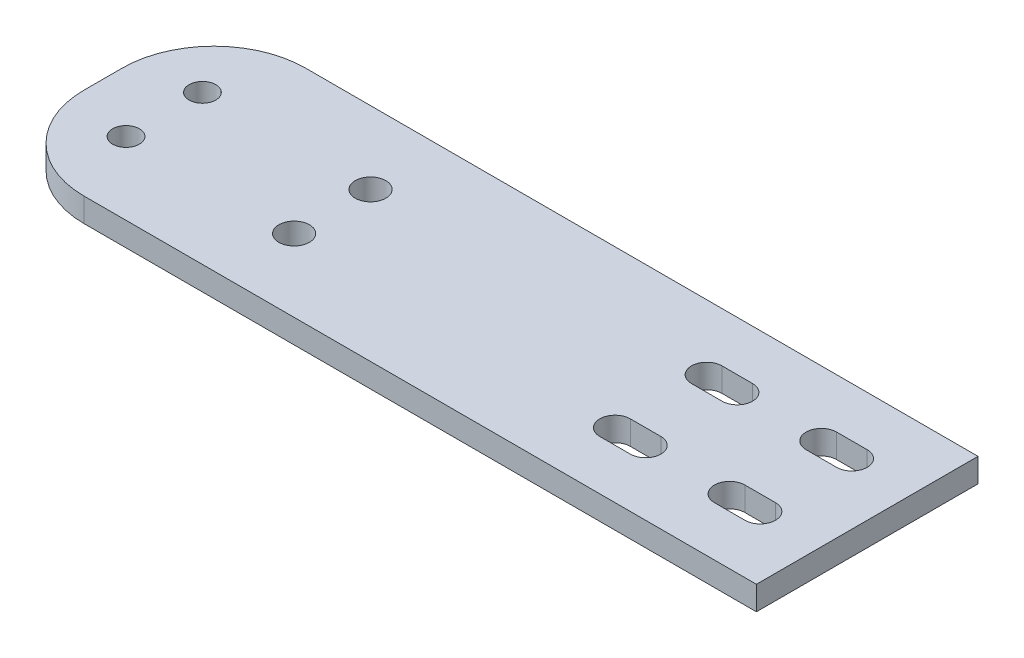
ISO-10303-21;
HEADER;
FILE_DESCRIPTION(('STEP AP214'),'2;1');
FILE_NAME('part.step','',(''),(''),'','','');
FILE_SCHEMA(('AUTOMOTIVE_DESIGN { 1 0 10303 214 1 1 1 1 }'));
ENDSEC;
DATA;
#1=APPLICATION_CONTEXT('core data for automotive mechanical design processes');
#2=APPLICATION_PROTOCOL_DEFINITION('international standard','automotive_design',2000,#1);
#3=PRODUCT_CONTEXT('',#1,'mechanical');
#4=PRODUCT('Part','Part','',(#3));
#5=PRODUCT_RELATED_PRODUCT_CATEGORY('part','',(#4));
#6=PRODUCT_DEFINITION_FORMATION('','',#4);
#7=PRODUCT_DEFINITION_CONTEXT('part definition',#1,'design');
#8=PRODUCT_DEFINITION('design','',#6,#7);
#9=PRODUCT_DEFINITION_SHAPE('','',#8);
#10=(LENGTH_UNIT() NAMED_UNIT(*) SI_UNIT(.MILLI.,.METRE.));
#11=(NAMED_UNIT(*) PLANE_ANGLE_UNIT() SI_UNIT($,.RADIAN.));
#12=(NAMED_UNIT(*) SI_UNIT($,.STERADIAN.) SOLID_ANGLE_UNIT());
#13=UNCERTAINTY_MEASURE_WITH_UNIT(LENGTH_MEASURE(1.E-05),#10,'distance_accuracy_value','');
#14=(GEOMETRIC_REPRESENTATION_CONTEXT(3) GLOBAL_UNCERTAINTY_ASSIGNED_CONTEXT((#13)) GLOBAL_UNIT_ASSIGNED_CONTEXT((#10,
#11,#12)) REPRESENTATION_CONTEXT('',''));
#15=CARTESIAN_POINT('',(0.,0.,0.));
#16=DIRECTION('',(0.,0.,1.));
#17=DIRECTION('',(1.,0.,0.));
#18=AXIS2_PLACEMENT_3D('',#15,#16,#17);
#19=CARTESIAN_POINT('',(0.,6.25,-29.));
#20=DIRECTION('',(1.,0.,0.));
#21=DIRECTION('',(0.,0.,-1.));
#22=AXIS2_PLACEMENT_3D('',#19,#20,#21);
#23=PLANE('',#22);
#24=DIRECTION('',(0.,0.,1.));
#25=VECTOR('',#24,1.);
#26=CARTESIAN_POINT('',(0.,6.25,-29.));
#27=LINE('',#26,#25);
#28=CARTESIAN_POINT('',(0.,6.25,-5.00000000000002));
#29=VERTEX_POINT('',#28);
#30=CARTESIAN_POINT('',(0.,6.25,4.99999999999999));
#31=VERTEX_POINT('',#30);
#32=EDGE_CURVE('E336',#29,#31,#27,.T.);
#33=ORIENTED_EDGE('',*,*,#32,.F.);
#34=DIRECTION('',(0.,-1.,0.));
#35=VECTOR('',#34,1.);
#36=CARTESIAN_POINT('',(0.,6.25,-5.00000000000002));
#37=LINE('',#36,#35);
#38=CARTESIAN_POINT('',(0.,0.,-5.00000000000002));
#39=VERTEX_POINT('',#38);
#40=EDGE_CURVE('E360',#29,#39,#37,.T.);
#41=ORIENTED_EDGE('',*,*,#40,.T.);
#42=DIRECTION('',(0.,0.,1.));
#43=VECTOR('',#42,1.);
#44=CARTESIAN_POINT('',(0.,0.,-29.));
#45=LINE('',#44,#43);
#46=CARTESIAN_POINT('',(0.,0.,4.99999999999999));
#47=VERTEX_POINT('',#46);
#48=EDGE_CURVE('E333',#39,#47,#45,.T.);
#49=ORIENTED_EDGE('',*,*,#48,.T.);
#50=DIRECTION('',(0.,-1.,0.));
#51=VECTOR('',#50,1.);
#52=CARTESIAN_POINT('',(0.,6.25,5.));
#53=LINE('',#52,#51);
#54=EDGE_CURVE('E358',#47,#31,#53,.F.);
#55=ORIENTED_EDGE('',*,*,#54,.T.);
#56=EDGE_LOOP('',(#33,#41,#49,#55));
#57=FACE_BOUND('',#56,.T.);
#58=ADVANCED_FACE('F33',(#57),#23,.F.);
#59=CARTESIAN_POINT('',(0.,6.25,29.));
#60=DIRECTION('',(0.,0.,-1.));
#61=DIRECTION('',(-1.,0.,0.));
#62=AXIS2_PLACEMENT_3D('',#59,#60,#61);
#63=PLANE('',#62);
#64=DIRECTION('',(1.,0.,0.));
#65=VECTOR('',#64,1.);
#66=CARTESIAN_POINT('',(0.,6.25,29.));
#67=LINE('',#66,#65);
#68=CARTESIAN_POINT('',(24.,6.25,29.));
#69=VERTEX_POINT('',#68);
#70=CARTESIAN_POINT('',(200.,6.25,29.));
#71=VERTEX_POINT('',#70);
#72=EDGE_CURVE('E338',#69,#71,#67,.T.);
#73=ORIENTED_EDGE('',*,*,#72,.F.);
#74=DIRECTION('',(0.,-1.,0.));
#75=VECTOR('',#74,1.);
#76=CARTESIAN_POINT('',(24.,6.25,29.));
#77=LINE('',#76,#75);
#78=CARTESIAN_POINT('',(24.,0.,29.));
#79=VERTEX_POINT('',#78);
#80=EDGE_CURVE('E11',#69,#79,#77,.T.);
#81=ORIENTED_EDGE('',*,*,#80,.T.);
#82=DIRECTION('',(1.,0.,0.));
#83=VECTOR('',#82,1.);
#84=CARTESIAN_POINT('',(0.,0.,29.));
#85=LINE('',#84,#83);
#86=CARTESIAN_POINT('',(200.,0.,29.));
#87=VERTEX_POINT('',#86);
#88=EDGE_CURVE('E348',#79,#87,#85,.T.);
#89=ORIENTED_EDGE('',*,*,#88,.T.);
#90=DIRECTION('',(0.,-1.,0.));
#91=VECTOR('',#90,1.);
#92=CARTESIAN_POINT('',(200.,6.25,29.));
#93=LINE('',#92,#91);
#94=EDGE_CURVE('E355',#71,#87,#93,.T.);
#95=ORIENTED_EDGE('',*,*,#94,.F.);
#96=EDGE_LOOP('',(#73,#81,#89,#95));
#97=FACE_BOUND('',#96,.T.);
#98=ADVANCED_FACE('F388',(#97),#63,.F.);
#99=CARTESIAN_POINT('',(200.,6.25,-29.0000000000001));
#100=DIRECTION('',(-1.,0.,0.));
#101=DIRECTION('',(0.,0.,1.));
#102=AXIS2_PLACEMENT_3D('',#99,#100,#101);
#103=PLANE('',#102);
#104=DIRECTION('',(0.,0.,-1.));
#105=VECTOR('',#104,1.);
#106=CARTESIAN_POINT('',(200.,0.,-29.0000000000001));
#107=LINE('',#106,#105);
#108=CARTESIAN_POINT('',(200.,0.,-29.0000000000001));
#109=VERTEX_POINT('',#108);
#110=EDGE_CURVE('E350',#87,#109,#107,.T.);
#111=ORIENTED_EDGE('',*,*,#110,.T.);
#112=DIRECTION('',(0.,-1.,0.));
#113=VECTOR('',#112,1.);
#114=CARTESIAN_POINT('',(200.,6.25,-29.0000000000001));
#115=LINE('',#114,#113);
#116=CARTESIAN_POINT('',(200.,6.25,-29.0000000000001));
#117=VERTEX_POINT('',#116);
#118=EDGE_CURVE('E345',#117,#109,#115,.T.);
#119=ORIENTED_EDGE('',*,*,#118,.F.);
#120=DIRECTION('',(0.,0.,-1.));
#121=VECTOR('',#120,1.);
#122=CARTESIAN_POINT('',(200.,6.25,-29.0000000000001));
#123=LINE('',#122,#121);
#124=EDGE_CURVE('E341',#71,#117,#123,.T.);
#125=ORIENTED_EDGE('',*,*,#124,.F.);
#126=ORIENTED_EDGE('',*,*,#94,.T.);
#127=EDGE_LOOP('',(#111,#119,#125,#126));
#128=FACE_BOUND('',#127,.T.);
#129=ADVANCED_FACE('F384',(#128),#103,.F.);
#130=CARTESIAN_POINT('',(0.,6.25,-29.));
#131=DIRECTION('',(0.,0.,1.));
#132=DIRECTION('',(1.,0.,0.));
#133=AXIS2_PLACEMENT_3D('',#130,#131,#132);
#134=PLANE('',#133);
#135=DIRECTION('',(-1.,0.,0.));
#136=VECTOR('',#135,1.);
#137=CARTESIAN_POINT('',(0.,0.,-29.));
#138=LINE('',#137,#136);
#139=CARTESIAN_POINT('',(24.,0.,-29.));
#140=VERTEX_POINT('',#139);
#141=EDGE_CURVE('E339',#109,#140,#138,.T.);
#142=ORIENTED_EDGE('',*,*,#141,.T.);
#143=DIRECTION('',(0.,-1.,0.));
#144=VECTOR('',#143,1.);
#145=CARTESIAN_POINT('',(24.,6.25,-29.));
#146=LINE('',#145,#144);
#147=CARTESIAN_POINT('',(24.,6.25,-29.));
#148=VERTEX_POINT('',#147);
#149=EDGE_CURVE('E56',#140,#148,#146,.F.);
#150=ORIENTED_EDGE('',*,*,#149,.T.);
#151=DIRECTION('',(-1.,0.,0.));
#152=VECTOR('',#151,1.);
#153=CARTESIAN_POINT('',(0.,6.25,-29.));
#154=LINE('',#153,#152);
#155=EDGE_CURVE('E343',#117,#148,#154,.T.);
#156=ORIENTED_EDGE('',*,*,#155,.F.);
#157=ORIENTED_EDGE('',*,*,#118,.T.);
#158=EDGE_LOOP('',(#142,#150,#156,#157));
#159=FACE_BOUND('',#158,.T.);
#160=ADVANCED_FACE('F380',(#159),#134,.F.);
#161=CARTESIAN_POINT('',(0.,6.25,0.));
#162=DIRECTION('',(0.,1.,0.));
#163=DIRECTION('',(0.,0.,1.));
#164=AXIS2_PLACEMENT_3D('',#161,#162,#163);
#165=PLANE('',#164);
#166=CARTESIAN_POINT('',(60.,6.25,10.));
#167=DIRECTION('',(0.,1.,0.));
#168=DIRECTION('',(0.,0.,1.));
#169=AXIS2_PLACEMENT_3D('',#166,#167,#168);
#170=CIRCLE('',#169,4.00000000000001);
#171=CARTESIAN_POINT('',(60.,6.25,14.));
#172=VERTEX_POINT('',#171);
#173=EDGE_CURVE('E220',#172,#172,#170,.F.);
#174=ORIENTED_EDGE('',*,*,#173,.T.);
#175=EDGE_LOOP('',(#174));
#176=FACE_BOUND('',#175,.T.);
#177=CARTESIAN_POINT('',(60.,6.25,-10.));
#178=DIRECTION('',(0.,1.,0.));
#179=DIRECTION('',(0.,0.,1.));
#180=AXIS2_PLACEMENT_3D('',#177,#178,#179);
#181=CIRCLE('',#180,4.00000000000001);
#182=CARTESIAN_POINT('',(60.,6.25,-5.99999999999999));
#183=VERTEX_POINT('',#182);
#184=EDGE_CURVE('E495',#183,#183,#181,.F.);
#185=ORIENTED_EDGE('',*,*,#184,.T.);
#186=EDGE_LOOP('',(#185));
#187=FACE_BOUND('',#186,.T.);
#188=DIRECTION('',(1.,0.,0.));
#189=VECTOR('',#188,1.);
#190=CARTESIAN_POINT('',(146.,6.25,16.0000000000006));
#191=LINE('',#190,#189);
#192=CARTESIAN_POINT('',(146.,6.25,16.0000000000006));
#193=VERTEX_POINT('',#192);
#194=CARTESIAN_POINT('',(154.,6.25,15.9999999999983));
#195=VERTEX_POINT('',#194);
#196=EDGE_CURVE('E266',#193,#195,#191,.T.);
#197=ORIENTED_EDGE('',*,*,#196,.F.);
#198=CARTESIAN_POINT('',(146.,6.25,11.9999999999978));
#199=DIRECTION('',(0.,1.,0.));
#200=DIRECTION('',(0.,0.,1.));
#201=AXIS2_PLACEMENT_3D('',#198,#199,#200);
#202=CIRCLE('',#201,4.00000000000142);
#203=CARTESIAN_POINT('',(146.,6.25,7.99999999999778));
#204=VERTEX_POINT('',#203);
#205=EDGE_CURVE('E264',#204,#193,#202,.T.);
#206=ORIENTED_EDGE('',*,*,#205,.F.);
#207=DIRECTION('',(-1.,0.,-2.00143721040848E-13));
#208=VECTOR('',#207,1.);
#209=CARTESIAN_POINT('',(146.,6.25,7.99999999999778));
#210=LINE('',#209,#208);
#211=CARTESIAN_POINT('',(153.999999999999,6.25,7.99999999999938));
#212=VERTEX_POINT('',#211);
#213=EDGE_CURVE('E272',#212,#204,#210,.T.);
#214=ORIENTED_EDGE('',*,*,#213,.F.);
#215=CARTESIAN_POINT('',(154.,6.25,11.9999999999977));
#216=DIRECTION('',(0.,1.,0.));
#217=DIRECTION('',(0.,0.,1.));
#218=AXIS2_PLACEMENT_3D('',#215,#216,#217);
#219=CIRCLE('',#218,4.00000000000061);
#220=EDGE_CURVE('E269',#195,#212,#219,.T.);
#221=ORIENTED_EDGE('',*,*,#220,.F.);
#222=EDGE_LOOP('',(#197,#206,#214,#221));
#223=FACE_BOUND('',#222,.T.);
#224=DIRECTION('',(1.,0.,0.));
#225=VECTOR('',#224,1.);
#226=CARTESIAN_POINT('',(146.,6.25,-7.99999999999979));
#227=LINE('',#226,#225);
#228=CARTESIAN_POINT('',(146.,6.25,-7.99999999999979));
#229=VERTEX_POINT('',#228);
#230=CARTESIAN_POINT('',(154.,6.25,-8.00000000000074));
#231=VERTEX_POINT('',#230);
#232=EDGE_CURVE('E233',#229,#231,#227,.T.);
#233=ORIENTED_EDGE('',*,*,#232,.F.);
#234=CARTESIAN_POINT('',(146.,6.25,-12.0000000000022));
#235=DIRECTION('',(0.,1.,0.));
#236=DIRECTION('',(0.,0.,1.));
#237=AXIS2_PLACEMENT_3D('',#234,#235,#236);
#238=CIRCLE('',#237,4.00000000000151);
#239=CARTESIAN_POINT('',(146.,6.25,-16.0000000000028));
#240=VERTEX_POINT('',#239);
#241=EDGE_CURVE('E231',#240,#229,#238,.T.);
#242=ORIENTED_EDGE('',*,*,#241,.F.);
#243=DIRECTION('',(-1.,0.,0.));
#244=VECTOR('',#243,1.);
#245=CARTESIAN_POINT('',(146.,6.25,-16.0000000000028));
#246=LINE('',#245,#244);
#247=CARTESIAN_POINT('',(154.,6.25,-16.0000000000029));
#248=VERTEX_POINT('',#247);
#249=EDGE_CURVE('E239',#248,#240,#246,.T.);
#250=ORIENTED_EDGE('',*,*,#249,.F.);
#251=CARTESIAN_POINT('',(154.,6.25,-12.0000000000023));
#252=DIRECTION('',(0.,1.,0.));
#253=DIRECTION('',(0.,0.,1.));
#254=AXIS2_PLACEMENT_3D('',#251,#252,#253);
#255=CIRCLE('',#254,4.00000000000154);
#256=EDGE_CURVE('E236',#231,#248,#255,.T.);
#257=ORIENTED_EDGE('',*,*,#256,.F.);
#258=EDGE_LOOP('',(#233,#242,#250,#257));
#259=FACE_BOUND('',#258,.T.);
#260=DIRECTION('',(1.,0.,0.));
#261=VECTOR('',#260,1.);
#262=CARTESIAN_POINT('',(176.,6.25,-8.));
#263=LINE('',#262,#261);
#264=CARTESIAN_POINT('',(176.,6.25,-8.));
#265=VERTEX_POINT('',#264);
#266=CARTESIAN_POINT('',(184.,6.25,-8.00000000000156));
#267=VERTEX_POINT('',#266);
#268=EDGE_CURVE('E303',#265,#267,#263,.T.);
#269=ORIENTED_EDGE('',*,*,#268,.F.);
#270=CARTESIAN_POINT('',(176.,6.25,-12.0000000000018));
#271=DIRECTION('',(0.,1.,0.));
#272=DIRECTION('',(0.,0.,1.));
#273=AXIS2_PLACEMENT_3D('',#270,#271,#272);
#274=CIRCLE('',#273,4.00000000000093);
#275=CARTESIAN_POINT('',(176.,6.25,-16.0000000000019));
#276=VERTEX_POINT('',#275);
#277=EDGE_CURVE('E301',#276,#265,#274,.T.);
#278=ORIENTED_EDGE('',*,*,#277,.F.);
#279=DIRECTION('',(-1.,0.,0.));
#280=VECTOR('',#279,1.);
#281=CARTESIAN_POINT('',(176.,6.25,-16.0000000000019));
#282=LINE('',#281,#280);
#283=CARTESIAN_POINT('',(184.,6.25,-16.0000000000019));
#284=VERTEX_POINT('',#283);
#285=EDGE_CURVE('E309',#284,#276,#282,.T.);
#286=ORIENTED_EDGE('',*,*,#285,.F.);
#287=CARTESIAN_POINT('',(184.,6.25,-12.0000000000025));
#288=DIRECTION('',(0.,1.,0.));
#289=DIRECTION('',(0.,0.,1.));
#290=AXIS2_PLACEMENT_3D('',#287,#288,#289);
#291=CIRCLE('',#290,4.00000000000093);
#292=EDGE_CURVE('E306',#267,#284,#291,.T.);
#293=ORIENTED_EDGE('',*,*,#292,.F.);
#294=EDGE_LOOP('',(#269,#278,#286,#293));
#295=FACE_BOUND('',#294,.T.);
#296=CARTESIAN_POINT('',(16.,6.25,9.99999999999989));
#297=DIRECTION('',(0.,1.,0.));
#298=DIRECTION('',(0.,0.,1.));
#299=AXIS2_PLACEMENT_3D('',#296,#297,#298);
#300=CIRCLE('',#299,3.49999999999997);
#301=CARTESIAN_POINT('',(16.,6.25,13.4999999999999));
#302=VERTEX_POINT('',#301);
#303=EDGE_CURVE('E293',#302,#302,#300,.T.);
#304=ORIENTED_EDGE('',*,*,#303,.F.);
#305=EDGE_LOOP('',(#304));
#306=FACE_BOUND('',#305,.T.);
#307=DIRECTION('',(1.,0.,0.));
#308=VECTOR('',#307,1.);
#309=CARTESIAN_POINT('',(176.,6.25,16.));
#310=LINE('',#309,#308);
#311=CARTESIAN_POINT('',(176.,6.25,16.));
#312=VERTEX_POINT('',#311);
#313=CARTESIAN_POINT('',(184.,6.25,15.9999999999988));
#314=VERTEX_POINT('',#313);
#315=EDGE_CURVE('E196',#312,#314,#310,.T.);
#316=ORIENTED_EDGE('',*,*,#315,.F.);
#317=CARTESIAN_POINT('',(176.,6.25,11.9999999999976));
#318=DIRECTION('',(0.,1.,0.));
#319=DIRECTION('',(0.,0.,1.));
#320=AXIS2_PLACEMENT_3D('',#317,#318,#319);
#321=CIRCLE('',#320,4.00000000000031);
#322=CARTESIAN_POINT('',(176.,6.25,7.99999999999938));
#323=VERTEX_POINT('',#322);
#324=EDGE_CURVE('E186',#323,#312,#321,.T.);
#325=ORIENTED_EDGE('',*,*,#324,.F.);
#326=DIRECTION('',(-1.,0.,2.33753988387862E-13));
#327=VECTOR('',#326,1.);
#328=CARTESIAN_POINT('',(176.,6.25,7.99999999999938));
#329=LINE('',#328,#327);
#330=CARTESIAN_POINT('',(184.,6.25,7.99999999999751));
#331=VERTEX_POINT('',#330);
#332=EDGE_CURVE('E213',#331,#323,#329,.T.);
#333=ORIENTED_EDGE('',*,*,#332,.F.);
#334=CARTESIAN_POINT('',(184.,6.25,11.9999999999975));
#335=DIRECTION('',(0.,1.,0.));
#336=DIRECTION('',(0.,0.,1.));
#337=AXIS2_PLACEMENT_3D('',#334,#335,#336);
#338=CIRCLE('',#337,4.00000000000124);
#339=EDGE_CURVE('E211',#314,#331,#338,.T.);
#340=ORIENTED_EDGE('',*,*,#339,.F.);
#341=EDGE_LOOP('',(#316,#325,#333,#340));
#342=FACE_BOUND('',#341,.T.);
#343=CARTESIAN_POINT('',(16.,6.25,-10.0000000000001));
#344=DIRECTION('',(0.,1.,0.));
#345=DIRECTION('',(0.,0.,1.));
#346=AXIS2_PLACEMENT_3D('',#343,#344,#345);
#347=CIRCLE('',#346,3.49999999999996);
#348=CARTESIAN_POINT('',(16.,6.25,-6.50000000000015));
#349=VERTEX_POINT('',#348);
#350=EDGE_CURVE('E330',#349,#349,#347,.T.);
#351=ORIENTED_EDGE('',*,*,#350,.F.);
#352=EDGE_LOOP('',(#351));
#353=FACE_BOUND('',#352,.T.);
#354=ORIENTED_EDGE('',*,*,#155,.T.);
#355=CARTESIAN_POINT('',(24.,6.25,-5.00000000000003));
#356=DIRECTION('',(0.,1.,0.));
#357=DIRECTION('',(0.,0.,1.));
#358=AXIS2_PLACEMENT_3D('',#355,#356,#357);
#359=CIRCLE('',#358,24.);
#360=EDGE_CURVE('E41',#148,#29,#359,.T.);
#361=ORIENTED_EDGE('',*,*,#360,.T.);
#362=ORIENTED_EDGE('',*,*,#32,.T.);
#363=CARTESIAN_POINT('',(24.,6.25,5.));
#364=DIRECTION('',(0.,1.,0.));
#365=DIRECTION('',(0.,0.,1.));
#366=AXIS2_PLACEMENT_3D('',#363,#364,#365);
#367=CIRCLE('',#366,24.);
#368=EDGE_CURVE('E48',#31,#69,#367,.T.);
#369=ORIENTED_EDGE('',*,*,#368,.T.);
#370=ORIENTED_EDGE('',*,*,#72,.T.);
#371=ORIENTED_EDGE('',*,*,#124,.T.);
#372=EDGE_LOOP('',(#354,#361,#362,#369,#370,#371));
#373=FACE_BOUND('',#372,.T.);
#374=ADVANCED_FACE('F208',(#176,#187,#223,#259,#295,#306,#342,#353,#373),#165,.T.);
#375=CARTESIAN_POINT('',(0.,0.,0.));
#376=DIRECTION('',(0.,1.,0.));
#377=DIRECTION('',(0.,0.,1.));
#378=AXIS2_PLACEMENT_3D('',#375,#376,#377);
#379=PLANE('',#378);
#380=CARTESIAN_POINT('',(60.,0.,10.));
#381=DIRECTION('',(0.,1.,0.));
#382=DIRECTION('',(0.,0.,1.));
#383=AXIS2_PLACEMENT_3D('',#380,#381,#382);
#384=CIRCLE('',#383,4.00000000000001);
#385=CARTESIAN_POINT('',(60.,0.,14.));
#386=VERTEX_POINT('',#385);
#387=EDGE_CURVE('E494',#386,#386,#384,.T.);
#388=ORIENTED_EDGE('',*,*,#387,.T.);
#389=EDGE_LOOP('',(#388));
#390=FACE_BOUND('',#389,.T.);
#391=CARTESIAN_POINT('',(60.,0.,-10.));
#392=DIRECTION('',(0.,1.,0.));
#393=DIRECTION('',(0.,0.,1.));
#394=AXIS2_PLACEMENT_3D('',#391,#392,#393);
#395=CIRCLE('',#394,4.00000000000001);
#396=CARTESIAN_POINT('',(60.,0.,-5.99999999999999));
#397=VERTEX_POINT('',#396);
#398=EDGE_CURVE('E496',#397,#397,#395,.T.);
#399=ORIENTED_EDGE('',*,*,#398,.T.);
#400=EDGE_LOOP('',(#399));
#401=FACE_BOUND('',#400,.T.);
#402=CARTESIAN_POINT('',(146.,0.,11.9999999999978));
#403=DIRECTION('',(0.,1.,0.));
#404=DIRECTION('',(0.,0.,1.));
#405=AXIS2_PLACEMENT_3D('',#402,#403,#404);
#406=CIRCLE('',#405,4.00000000000142);
#407=CARTESIAN_POINT('',(146.,0.,7.99999999999778));
#408=VERTEX_POINT('',#407);
#409=CARTESIAN_POINT('',(146.,0.,16.0000000000006));
#410=VERTEX_POINT('',#409);
#411=EDGE_CURVE('E204',#408,#410,#406,.T.);
#412=ORIENTED_EDGE('',*,*,#411,.T.);
#413=DIRECTION('',(1.,0.,0.));
#414=VECTOR('',#413,1.);
#415=CARTESIAN_POINT('',(146.,0.,16.0000000000006));
#416=LINE('',#415,#414);
#417=CARTESIAN_POINT('',(154.,0.,15.9999999999983));
#418=VERTEX_POINT('',#417);
#419=EDGE_CURVE('E277',#410,#418,#416,.T.);
#420=ORIENTED_EDGE('',*,*,#419,.T.);
#421=CARTESIAN_POINT('',(154.,0.,11.9999999999977));
#422=DIRECTION('',(0.,1.,0.));
#423=DIRECTION('',(0.,0.,1.));
#424=AXIS2_PLACEMENT_3D('',#421,#422,#423);
#425=CIRCLE('',#424,4.00000000000061);
#426=CARTESIAN_POINT('',(153.999999999999,0.,7.99999999999938));
#427=VERTEX_POINT('',#426);
#428=EDGE_CURVE('E280',#418,#427,#425,.T.);
#429=ORIENTED_EDGE('',*,*,#428,.T.);
#430=DIRECTION('',(-1.,0.,-2.00143721040848E-13));
#431=VECTOR('',#430,1.);
#432=CARTESIAN_POINT('',(146.,0.,7.99999999999778));
#433=LINE('',#432,#431);
#434=EDGE_CURVE('E267',#427,#408,#433,.T.);
#435=ORIENTED_EDGE('',*,*,#434,.T.);
#436=EDGE_LOOP('',(#412,#420,#429,#435));
#437=FACE_BOUND('',#436,.T.);
#438=CARTESIAN_POINT('',(146.,0.,-12.0000000000022));
#439=DIRECTION('',(0.,1.,0.));
#440=DIRECTION('',(0.,0.,1.));
#441=AXIS2_PLACEMENT_3D('',#438,#439,#440);
#442=CIRCLE('',#441,4.00000000000151);
#443=CARTESIAN_POINT('',(146.,0.,-16.0000000000028));
#444=VERTEX_POINT('',#443);
#445=CARTESIAN_POINT('',(146.,0.,-7.99999999999979));
#446=VERTEX_POINT('',#445);
#447=EDGE_CURVE('E242',#444,#446,#442,.T.);
#448=ORIENTED_EDGE('',*,*,#447,.T.);
#449=DIRECTION('',(1.,0.,0.));
#450=VECTOR('',#449,1.);
#451=CARTESIAN_POINT('',(146.,0.,-7.99999999999979));
#452=LINE('',#451,#450);
#453=CARTESIAN_POINT('',(154.,0.,-8.00000000000074));
#454=VERTEX_POINT('',#453);
#455=EDGE_CURVE('E245',#446,#454,#452,.T.);
#456=ORIENTED_EDGE('',*,*,#455,.T.);
#457=CARTESIAN_POINT('',(154.,0.,-12.0000000000023));
#458=DIRECTION('',(0.,1.,0.));
#459=DIRECTION('',(0.,0.,1.));
#460=AXIS2_PLACEMENT_3D('',#457,#458,#459);
#461=CIRCLE('',#460,4.00000000000154);
#462=CARTESIAN_POINT('',(154.,0.,-16.0000000000029));
#463=VERTEX_POINT('',#462);
#464=EDGE_CURVE('E249',#454,#463,#461,.T.);
#465=ORIENTED_EDGE('',*,*,#464,.T.);
#466=DIRECTION('',(-1.,0.,0.));
#467=VECTOR('',#466,1.);
#468=CARTESIAN_POINT('',(146.,0.,-16.0000000000028));
#469=LINE('',#468,#467);
#470=EDGE_CURVE('E234',#463,#444,#469,.T.);
#471=ORIENTED_EDGE('',*,*,#470,.T.);
#472=EDGE_LOOP('',(#448,#456,#465,#471));
#473=FACE_BOUND('',#472,.T.);
#474=CARTESIAN_POINT('',(176.,0.,-12.0000000000018));
#475=DIRECTION('',(0.,1.,0.));
#476=DIRECTION('',(0.,0.,1.));
#477=AXIS2_PLACEMENT_3D('',#474,#475,#476);
#478=CIRCLE('',#477,4.00000000000093);
#479=CARTESIAN_POINT('',(176.,0.,-16.0000000000019));
#480=VERTEX_POINT('',#479);
#481=CARTESIAN_POINT('',(176.,0.,-8.));
#482=VERTEX_POINT('',#481);
#483=EDGE_CURVE('E263',#480,#482,#478,.T.);
#484=ORIENTED_EDGE('',*,*,#483,.T.);
#485=DIRECTION('',(1.,0.,0.));
#486=VECTOR('',#485,1.);
#487=CARTESIAN_POINT('',(176.,0.,-8.));
#488=LINE('',#487,#486);
#489=CARTESIAN_POINT('',(184.,0.,-8.00000000000156));
#490=VERTEX_POINT('',#489);
#491=EDGE_CURVE('E314',#482,#490,#488,.T.);
#492=ORIENTED_EDGE('',*,*,#491,.T.);
#493=CARTESIAN_POINT('',(184.,0.,-12.0000000000025));
#494=DIRECTION('',(0.,1.,0.));
#495=DIRECTION('',(0.,0.,1.));
#496=AXIS2_PLACEMENT_3D('',#493,#494,#495);
#497=CIRCLE('',#496,4.00000000000093);
#498=CARTESIAN_POINT('',(184.,0.,-16.0000000000019));
#499=VERTEX_POINT('',#498);
#500=EDGE_CURVE('E317',#490,#499,#497,.T.);
#501=ORIENTED_EDGE('',*,*,#500,.T.);
#502=DIRECTION('',(-1.,0.,0.));
#503=VECTOR('',#502,1.);
#504=CARTESIAN_POINT('',(176.,0.,-16.0000000000019));
#505=LINE('',#504,#503);
#506=EDGE_CURVE('E304',#499,#480,#505,.T.);
#507=ORIENTED_EDGE('',*,*,#506,.T.);
#508=EDGE_LOOP('',(#484,#492,#501,#507));
#509=FACE_BOUND('',#508,.T.);
#510=CARTESIAN_POINT('',(16.,0.,9.99999999999989));
#511=DIRECTION('',(0.,1.,0.));
#512=DIRECTION('',(0.,0.,1.));
#513=AXIS2_PLACEMENT_3D('',#510,#511,#512);
#514=CIRCLE('',#513,3.49999999999997);
#515=CARTESIAN_POINT('',(16.,0.,13.4999999999999));
#516=VERTEX_POINT('',#515);
#517=EDGE_CURVE('E297',#516,#516,#514,.T.);
#518=ORIENTED_EDGE('',*,*,#517,.T.);
#519=EDGE_LOOP('',(#518));
#520=FACE_BOUND('',#519,.T.);
#521=CARTESIAN_POINT('',(176.,0.,11.9999999999976));
#522=DIRECTION('',(0.,1.,0.));
#523=DIRECTION('',(0.,0.,1.));
#524=AXIS2_PLACEMENT_3D('',#521,#522,#523);
#525=CIRCLE('',#524,4.00000000000031);
#526=CARTESIAN_POINT('',(176.,0.,7.99999999999938));
#527=VERTEX_POINT('',#526);
#528=CARTESIAN_POINT('',(176.,0.,16.));
#529=VERTEX_POINT('',#528);
#530=EDGE_CURVE('E218',#527,#529,#525,.T.);
#531=ORIENTED_EDGE('',*,*,#530,.T.);
#532=DIRECTION('',(1.,0.,0.));
#533=VECTOR('',#532,1.);
#534=CARTESIAN_POINT('',(176.,0.,16.));
#535=LINE('',#534,#533);
#536=CARTESIAN_POINT('',(184.,0.,15.9999999999988));
#537=VERTEX_POINT('',#536);
#538=EDGE_CURVE('E203',#529,#537,#535,.T.);
#539=ORIENTED_EDGE('',*,*,#538,.T.);
#540=CARTESIAN_POINT('',(184.,0.,11.9999999999975));
#541=DIRECTION('',(0.,1.,0.));
#542=DIRECTION('',(0.,0.,1.));
#543=AXIS2_PLACEMENT_3D('',#540,#541,#542);
#544=CIRCLE('',#543,4.00000000000124);
#545=CARTESIAN_POINT('',(184.,0.,7.99999999999751));
#546=VERTEX_POINT('',#545);
#547=EDGE_CURVE('E222',#537,#546,#544,.T.);
#548=ORIENTED_EDGE('',*,*,#547,.T.);
#549=DIRECTION('',(-1.,0.,2.33753988387862E-13));
#550=VECTOR('',#549,1.);
#551=CARTESIAN_POINT('',(176.,0.,7.99999999999938));
#552=LINE('',#551,#550);
#553=EDGE_CURVE('E197',#546,#527,#552,.T.);
#554=ORIENTED_EDGE('',*,*,#553,.T.);
#555=EDGE_LOOP('',(#531,#539,#548,#554));
#556=FACE_BOUND('',#555,.T.);
#557=CARTESIAN_POINT('',(16.,0.,-10.0000000000001));
#558=DIRECTION('',(0.,1.,0.));
#559=DIRECTION('',(0.,0.,1.));
#560=AXIS2_PLACEMENT_3D('',#557,#558,#559);
#561=CIRCLE('',#560,3.49999999999996);
#562=CARTESIAN_POINT('',(16.,0.,-6.50000000000015));
#563=VERTEX_POINT('',#562);
#564=EDGE_CURVE('E296',#563,#563,#561,.T.);
#565=ORIENTED_EDGE('',*,*,#564,.T.);
#566=EDGE_LOOP('',(#565));
#567=FACE_BOUND('',#566,.T.);
#568=ORIENTED_EDGE('',*,*,#48,.F.);
#569=CARTESIAN_POINT('',(24.,0.,-5.00000000000003));
#570=DIRECTION('',(0.,1.,0.));
#571=DIRECTION('',(0.,0.,1.));
#572=AXIS2_PLACEMENT_3D('',#569,#570,#571);
#573=CIRCLE('',#572,24.);
#574=EDGE_CURVE('E365',#39,#140,#573,.F.);
#575=ORIENTED_EDGE('',*,*,#574,.T.);
#576=ORIENTED_EDGE('',*,*,#141,.F.);
#577=ORIENTED_EDGE('',*,*,#110,.F.);
#578=ORIENTED_EDGE('',*,*,#88,.F.);
#579=CARTESIAN_POINT('',(24.,0.,5.));
#580=DIRECTION('',(0.,1.,0.));
#581=DIRECTION('',(0.,0.,1.));
#582=AXIS2_PLACEMENT_3D('',#579,#580,#581);
#583=CIRCLE('',#582,24.);
#584=EDGE_CURVE('E363',#79,#47,#583,.F.);
#585=ORIENTED_EDGE('',*,*,#584,.T.);
#586=EDGE_LOOP('',(#568,#575,#576,#577,#578,#585));
#587=FACE_BOUND('',#586,.T.);
#588=ADVANCED_FACE('F378',(#390,#401,#437,#473,#509,#520,#556,#567,#587),#379,.F.);
#589=CARTESIAN_POINT('',(16.,6.25,-10.0000000000001));
#590=DIRECTION('',(0.,-1.,0.));
#591=DIRECTION('',(0.,0.,-1.));
#592=AXIS2_PLACEMENT_3D('',#589,#590,#591);
#593=CYLINDRICAL_SURFACE('',#592,3.49999999999996);
#594=ORIENTED_EDGE('',*,*,#350,.T.);
#595=EDGE_LOOP('',(#594));
#596=FACE_BOUND('',#595,.T.);
#597=ORIENTED_EDGE('',*,*,#564,.F.);
#598=EDGE_LOOP('',(#597));
#599=FACE_BOUND('',#598,.T.);
#600=ADVANCED_FACE('F414',(#596,#599),#593,.F.);
#601=CARTESIAN_POINT('',(176.,6.25,11.9999999999976));
#602=DIRECTION('',(0.,-1.,0.));
#603=DIRECTION('',(0.,0.,-1.));
#604=AXIS2_PLACEMENT_3D('',#601,#602,#603);
#605=CYLINDRICAL_SURFACE('',#604,4.00000000000031);
#606=ORIENTED_EDGE('',*,*,#530,.F.);
#607=DIRECTION('',(0.,-1.,0.));
#608=VECTOR('',#607,1.);
#609=CARTESIAN_POINT('',(176.,6.25,7.99999999999938));
#610=LINE('',#609,#608);
#611=EDGE_CURVE('E192',#323,#527,#610,.T.);
#612=ORIENTED_EDGE('',*,*,#611,.F.);
#613=ORIENTED_EDGE('',*,*,#324,.T.);
#614=DIRECTION('',(0.,-1.,0.));
#615=VECTOR('',#614,1.);
#616=CARTESIAN_POINT('',(176.,6.25,16.));
#617=LINE('',#616,#615);
#618=EDGE_CURVE('E189',#312,#529,#617,.T.);
#619=ORIENTED_EDGE('',*,*,#618,.T.);
#620=EDGE_LOOP('',(#606,#612,#613,#619));
#621=FACE_BOUND('',#620,.T.);
#622=ADVANCED_FACE('F188',(#621),#605,.F.);
#623=CARTESIAN_POINT('',(176.,6.25,16.));
#624=DIRECTION('',(0.,0.,-1.));
#625=DIRECTION('',(-1.,0.,0.));
#626=AXIS2_PLACEMENT_3D('',#623,#624,#625);
#627=PLANE('',#626);
#628=ORIENTED_EDGE('',*,*,#538,.F.);
#629=ORIENTED_EDGE('',*,*,#618,.F.);
#630=ORIENTED_EDGE('',*,*,#315,.T.);
#631=DIRECTION('',(0.,-1.,0.));
#632=VECTOR('',#631,1.);
#633=CARTESIAN_POINT('',(184.,6.25,15.9999999999988));
#634=LINE('',#633,#632);
#635=EDGE_CURVE('E205',#314,#537,#634,.T.);
#636=ORIENTED_EDGE('',*,*,#635,.T.);
#637=EDGE_LOOP('',(#628,#629,#630,#636));
#638=FACE_BOUND('',#637,.T.);
#639=ADVANCED_FACE('F200',(#638),#627,.T.);
#640=CARTESIAN_POINT('',(184.,6.25,11.9999999999975));
#641=DIRECTION('',(0.,-1.,0.));
#642=DIRECTION('',(0.,0.,-1.));
#643=AXIS2_PLACEMENT_3D('',#640,#641,#642);
#644=CYLINDRICAL_SURFACE('',#643,4.00000000000124);
#645=ORIENTED_EDGE('',*,*,#547,.F.);
#646=ORIENTED_EDGE('',*,*,#635,.F.);
#647=ORIENTED_EDGE('',*,*,#339,.T.);
#648=DIRECTION('',(0.,-1.,0.));
#649=VECTOR('',#648,1.);
#650=CARTESIAN_POINT('',(184.,6.25,7.99999999999751));
#651=LINE('',#650,#649);
#652=EDGE_CURVE('E228',#331,#546,#651,.T.);
#653=ORIENTED_EDGE('',*,*,#652,.T.);
#654=EDGE_LOOP('',(#645,#646,#647,#653));
#655=FACE_BOUND('',#654,.T.);
#656=ADVANCED_FACE('F478',(#655),#644,.F.);
#657=CARTESIAN_POINT('',(176.,6.25,7.99999999999938));
#658=DIRECTION('',(2.33753988387862E-13,0.,1.));
#659=DIRECTION('',(1.,0.,-2.33753988387862E-13));
#660=AXIS2_PLACEMENT_3D('',#657,#658,#659);
#661=PLANE('',#660);
#662=ORIENTED_EDGE('',*,*,#553,.F.);
#663=ORIENTED_EDGE('',*,*,#652,.F.);
#664=ORIENTED_EDGE('',*,*,#332,.T.);
#665=ORIENTED_EDGE('',*,*,#611,.T.);
#666=EDGE_LOOP('',(#662,#663,#664,#665));
#667=FACE_BOUND('',#666,.T.);
#668=ADVANCED_FACE('F442',(#667),#661,.T.);
#669=CARTESIAN_POINT('',(16.,6.25,9.99999999999989));
#670=DIRECTION('',(0.,-1.,0.));
#671=DIRECTION('',(0.,0.,-1.));
#672=AXIS2_PLACEMENT_3D('',#669,#670,#671);
#673=CYLINDRICAL_SURFACE('',#672,3.49999999999997);
#674=ORIENTED_EDGE('',*,*,#303,.T.);
#675=EDGE_LOOP('',(#674));
#676=FACE_BOUND('',#675,.T.);
#677=ORIENTED_EDGE('',*,*,#517,.F.);
#678=EDGE_LOOP('',(#677));
#679=FACE_BOUND('',#678,.T.);
#680=ADVANCED_FACE('F426',(#676,#679),#673,.F.);
#681=CARTESIAN_POINT('',(176.,6.25,-12.0000000000018));
#682=DIRECTION('',(0.,-1.,0.));
#683=DIRECTION('',(0.,0.,-1.));
#684=AXIS2_PLACEMENT_3D('',#681,#682,#683);
#685=CYLINDRICAL_SURFACE('',#684,4.00000000000093);
#686=ORIENTED_EDGE('',*,*,#483,.F.);
#687=DIRECTION('',(0.,-1.,0.));
#688=VECTOR('',#687,1.);
#689=CARTESIAN_POINT('',(176.,6.25,-16.0000000000019));
#690=LINE('',#689,#688);
#691=EDGE_CURVE('E311',#276,#480,#690,.T.);
#692=ORIENTED_EDGE('',*,*,#691,.F.);
#693=ORIENTED_EDGE('',*,*,#277,.T.);
#694=DIRECTION('',(0.,-1.,0.));
#695=VECTOR('',#694,1.);
#696=CARTESIAN_POINT('',(176.,6.25,-8.));
#697=LINE('',#696,#695);
#698=EDGE_CURVE('E300',#265,#482,#697,.T.);
#699=ORIENTED_EDGE('',*,*,#698,.T.);
#700=EDGE_LOOP('',(#686,#692,#693,#699));
#701=FACE_BOUND('',#700,.T.);
#702=ADVANCED_FACE('F422',(#701),#685,.F.);
#703=CARTESIAN_POINT('',(176.,6.25,-8.));
#704=DIRECTION('',(0.,0.,-1.));
#705=DIRECTION('',(-1.,0.,0.));
#706=AXIS2_PLACEMENT_3D('',#703,#704,#705);
#707=PLANE('',#706);
#708=ORIENTED_EDGE('',*,*,#491,.F.);
#709=ORIENTED_EDGE('',*,*,#698,.F.);
#710=ORIENTED_EDGE('',*,*,#268,.T.);
#711=DIRECTION('',(0.,-1.,0.));
#712=VECTOR('',#711,1.);
#713=CARTESIAN_POINT('',(184.,6.25,-8.00000000000156));
#714=LINE('',#713,#712);
#715=EDGE_CURVE('E326',#267,#490,#714,.T.);
#716=ORIENTED_EDGE('',*,*,#715,.T.);
#717=EDGE_LOOP('',(#708,#709,#710,#716));
#718=FACE_BOUND('',#717,.T.);
#719=ADVANCED_FACE('F425',(#718),#707,.T.);
#720=CARTESIAN_POINT('',(184.,6.25,-12.0000000000025));
#721=DIRECTION('',(0.,-1.,0.));
#722=DIRECTION('',(0.,0.,-1.));
#723=AXIS2_PLACEMENT_3D('',#720,#721,#722);
#724=CYLINDRICAL_SURFACE('',#723,4.00000000000093);
#725=ORIENTED_EDGE('',*,*,#500,.F.);
#726=ORIENTED_EDGE('',*,*,#715,.F.);
#727=ORIENTED_EDGE('',*,*,#292,.T.);
#728=DIRECTION('',(0.,-1.,0.));
#729=VECTOR('',#728,1.);
#730=CARTESIAN_POINT('',(184.,6.25,-16.0000000000019));
#731=LINE('',#730,#729);
#732=EDGE_CURVE('E324',#284,#499,#731,.T.);
#733=ORIENTED_EDGE('',*,*,#732,.T.);
#734=EDGE_LOOP('',(#725,#726,#727,#733));
#735=FACE_BOUND('',#734,.T.);
#736=ADVANCED_FACE('F430',(#735),#724,.F.);
#737=CARTESIAN_POINT('',(176.,6.25,-16.0000000000019));
#738=DIRECTION('',(0.,0.,1.));
#739=DIRECTION('',(1.,0.,0.));
#740=AXIS2_PLACEMENT_3D('',#737,#738,#739);
#741=PLANE('',#740);
#742=ORIENTED_EDGE('',*,*,#506,.F.);
#743=ORIENTED_EDGE('',*,*,#732,.F.);
#744=ORIENTED_EDGE('',*,*,#285,.T.);
#745=ORIENTED_EDGE('',*,*,#691,.T.);
#746=EDGE_LOOP('',(#742,#743,#744,#745));
#747=FACE_BOUND('',#746,.T.);
#748=ADVANCED_FACE('F434',(#747),#741,.T.);
#749=CARTESIAN_POINT('',(146.,6.25,-12.0000000000022));
#750=DIRECTION('',(0.,-1.,0.));
#751=DIRECTION('',(0.,0.,-1.));
#752=AXIS2_PLACEMENT_3D('',#749,#750,#751);
#753=CYLINDRICAL_SURFACE('',#752,4.00000000000151);
#754=ORIENTED_EDGE('',*,*,#447,.F.);
#755=DIRECTION('',(0.,-1.,0.));
#756=VECTOR('',#755,1.);
#757=CARTESIAN_POINT('',(146.,6.25,-16.0000000000028));
#758=LINE('',#757,#756);
#759=EDGE_CURVE('E241',#240,#444,#758,.T.);
#760=ORIENTED_EDGE('',*,*,#759,.F.);
#761=ORIENTED_EDGE('',*,*,#241,.T.);
#762=DIRECTION('',(0.,-1.,0.));
#763=VECTOR('',#762,1.);
#764=CARTESIAN_POINT('',(146.,6.25,-7.99999999999979));
#765=LINE('',#764,#763);
#766=EDGE_CURVE('E260',#229,#446,#765,.T.);
#767=ORIENTED_EDGE('',*,*,#766,.T.);
#768=EDGE_LOOP('',(#754,#760,#761,#767));
#769=FACE_BOUND('',#768,.T.);
#770=ADVANCED_FACE('F438',(#769),#753,.F.);
#771=CARTESIAN_POINT('',(146.,6.25,-7.99999999999979));
#772=DIRECTION('',(0.,0.,-1.));
#773=DIRECTION('',(-1.,0.,0.));
#774=AXIS2_PLACEMENT_3D('',#771,#772,#773);
#775=PLANE('',#774);
#776=ORIENTED_EDGE('',*,*,#455,.F.);
#777=ORIENTED_EDGE('',*,*,#766,.F.);
#778=ORIENTED_EDGE('',*,*,#232,.T.);
#779=DIRECTION('',(0.,-1.,0.));
#780=VECTOR('',#779,1.);
#781=CARTESIAN_POINT('',(154.,6.25,-8.00000000000074));
#782=LINE('',#781,#780);
#783=EDGE_CURVE('E258',#231,#454,#782,.T.);
#784=ORIENTED_EDGE('',*,*,#783,.T.);
#785=EDGE_LOOP('',(#776,#777,#778,#784));
#786=FACE_BOUND('',#785,.T.);
#787=ADVANCED_FACE('F462',(#786),#775,.T.);
#788=CARTESIAN_POINT('',(154.,6.25,-12.0000000000023));
#789=DIRECTION('',(0.,-1.,0.));
#790=DIRECTION('',(0.,0.,-1.));
#791=AXIS2_PLACEMENT_3D('',#788,#789,#790);
#792=CYLINDRICAL_SURFACE('',#791,4.00000000000154);
#793=ORIENTED_EDGE('',*,*,#464,.F.);
#794=ORIENTED_EDGE('',*,*,#783,.F.);
#795=ORIENTED_EDGE('',*,*,#256,.T.);
#796=DIRECTION('',(0.,-1.,0.));
#797=VECTOR('',#796,1.);
#798=CARTESIAN_POINT('',(154.,6.25,-16.0000000000029));
#799=LINE('',#798,#797);
#800=EDGE_CURVE('E256',#248,#463,#799,.T.);
#801=ORIENTED_EDGE('',*,*,#800,.T.);
#802=EDGE_LOOP('',(#793,#794,#795,#801));
#803=FACE_BOUND('',#802,.T.);
#804=ADVANCED_FACE('F466',(#803),#792,.F.);
#805=CARTESIAN_POINT('',(146.,6.25,-16.0000000000028));
#806=DIRECTION('',(0.,0.,1.));
#807=DIRECTION('',(1.,0.,0.));
#808=AXIS2_PLACEMENT_3D('',#805,#806,#807);
#809=PLANE('',#808);
#810=ORIENTED_EDGE('',*,*,#470,.F.);
#811=ORIENTED_EDGE('',*,*,#800,.F.);
#812=ORIENTED_EDGE('',*,*,#249,.T.);
#813=ORIENTED_EDGE('',*,*,#759,.T.);
#814=EDGE_LOOP('',(#810,#811,#812,#813));
#815=FACE_BOUND('',#814,.T.);
#816=ADVANCED_FACE('F448',(#815),#809,.T.);
#817=CARTESIAN_POINT('',(146.,6.25,11.9999999999978));
#818=DIRECTION('',(0.,-1.,0.));
#819=DIRECTION('',(0.,0.,-1.));
#820=AXIS2_PLACEMENT_3D('',#817,#818,#819);
#821=CYLINDRICAL_SURFACE('',#820,4.00000000000142);
#822=ORIENTED_EDGE('',*,*,#411,.F.);
#823=DIRECTION('',(0.,-1.,0.));
#824=VECTOR('',#823,1.);
#825=CARTESIAN_POINT('',(146.,6.25,7.99999999999778));
#826=LINE('',#825,#824);
#827=EDGE_CURVE('E274',#204,#408,#826,.T.);
#828=ORIENTED_EDGE('',*,*,#827,.F.);
#829=ORIENTED_EDGE('',*,*,#205,.T.);
#830=DIRECTION('',(0.,-1.,0.));
#831=VECTOR('',#830,1.);
#832=CARTESIAN_POINT('',(146.,6.25,16.0000000000006));
#833=LINE('',#832,#831);
#834=EDGE_CURVE('E246',#193,#410,#833,.T.);
#835=ORIENTED_EDGE('',*,*,#834,.T.);
#836=EDGE_LOOP('',(#822,#828,#829,#835));
#837=FACE_BOUND('',#836,.T.);
#838=ADVANCED_FACE('F444',(#837),#821,.F.);
#839=CARTESIAN_POINT('',(146.,6.25,16.0000000000006));
#840=DIRECTION('',(0.,0.,-1.));
#841=DIRECTION('',(-1.,0.,0.));
#842=AXIS2_PLACEMENT_3D('',#839,#840,#841);
#843=PLANE('',#842);
#844=ORIENTED_EDGE('',*,*,#419,.F.);
#845=ORIENTED_EDGE('',*,*,#834,.F.);
#846=ORIENTED_EDGE('',*,*,#196,.T.);
#847=DIRECTION('',(0.,-1.,0.));
#848=VECTOR('',#847,1.);
#849=CARTESIAN_POINT('',(154.,6.25,15.9999999999983));
#850=LINE('',#849,#848);
#851=EDGE_CURVE('E289',#195,#418,#850,.T.);
#852=ORIENTED_EDGE('',*,*,#851,.T.);
#853=EDGE_LOOP('',(#844,#845,#846,#852));
#854=FACE_BOUND('',#853,.T.);
#855=ADVANCED_FACE('F447',(#854),#843,.T.);
#856=CARTESIAN_POINT('',(154.,6.25,11.9999999999977));
#857=DIRECTION('',(0.,-1.,0.));
#858=DIRECTION('',(0.,0.,-1.));
#859=AXIS2_PLACEMENT_3D('',#856,#857,#858);
#860=CYLINDRICAL_SURFACE('',#859,4.00000000000061);
#861=ORIENTED_EDGE('',*,*,#428,.F.);
#862=ORIENTED_EDGE('',*,*,#851,.F.);
#863=ORIENTED_EDGE('',*,*,#220,.T.);
#864=DIRECTION('',(0.,-1.,0.));
#865=VECTOR('',#864,1.);
#866=CARTESIAN_POINT('',(153.999999999999,6.25,7.99999999999938));
#867=LINE('',#866,#865);
#868=EDGE_CURVE('E287',#212,#427,#867,.T.);
#869=ORIENTED_EDGE('',*,*,#868,.T.);
#870=EDGE_LOOP('',(#861,#862,#863,#869));
#871=FACE_BOUND('',#870,.T.);
#872=ADVANCED_FACE('F452',(#871),#860,.F.);
#873=CARTESIAN_POINT('',(146.,6.25,7.99999999999778));
#874=DIRECTION('',(-2.00143721040848E-13,0.,1.));
#875=DIRECTION('',(1.,0.,2.00143721040848E-13));
#876=AXIS2_PLACEMENT_3D('',#873,#874,#875);
#877=PLANE('',#876);
#878=ORIENTED_EDGE('',*,*,#434,.F.);
#879=ORIENTED_EDGE('',*,*,#868,.F.);
#880=ORIENTED_EDGE('',*,*,#213,.T.);
#881=ORIENTED_EDGE('',*,*,#827,.T.);
#882=EDGE_LOOP('',(#878,#879,#880,#881));
#883=FACE_BOUND('',#882,.T.);
#884=ADVANCED_FACE('F400',(#883),#877,.T.);
#885=CARTESIAN_POINT('',(24.,6.25,-5.00000000000003));
#886=DIRECTION('',(0.,-1.,0.));
#887=DIRECTION('',(0.,0.,-1.));
#888=AXIS2_PLACEMENT_3D('',#885,#886,#887);
#889=CYLINDRICAL_SURFACE('',#888,24.);
#890=ORIENTED_EDGE('',*,*,#360,.F.);
#891=ORIENTED_EDGE('',*,*,#149,.F.);
#892=ORIENTED_EDGE('',*,*,#574,.F.);
#893=ORIENTED_EDGE('',*,*,#40,.F.);
#894=EDGE_LOOP('',(#890,#891,#892,#893));
#895=FACE_BOUND('',#894,.T.);
#896=ADVANCED_FACE('F375',(#895),#889,.T.);
#897=CARTESIAN_POINT('',(24.,6.25,5.));
#898=DIRECTION('',(0.,-1.,0.));
#899=DIRECTION('',(0.,0.,-1.));
#900=AXIS2_PLACEMENT_3D('',#897,#898,#899);
#901=CYLINDRICAL_SURFACE('',#900,24.);
#902=ORIENTED_EDGE('',*,*,#368,.F.);
#903=ORIENTED_EDGE('',*,*,#54,.F.);
#904=ORIENTED_EDGE('',*,*,#584,.F.);
#905=ORIENTED_EDGE('',*,*,#80,.F.);
#906=EDGE_LOOP('',(#902,#903,#904,#905));
#907=FACE_BOUND('',#906,.T.);
#908=ADVANCED_FACE('F35',(#907),#901,.T.);
#909=CARTESIAN_POINT('',(60.,10.,-10.));
#910=DIRECTION('',(0.,-1.,0.));
#911=DIRECTION('',(0.,0.,-1.));
#912=AXIS2_PLACEMENT_3D('',#909,#910,#911);
#913=CYLINDRICAL_SURFACE('',#912,4.00000000000001);
#914=ORIENTED_EDGE('',*,*,#184,.F.);
#915=EDGE_LOOP('',(#914));
#916=FACE_BOUND('',#915,.T.);
#917=ORIENTED_EDGE('',*,*,#398,.F.);
#918=EDGE_LOOP('',(#917));
#919=FACE_BOUND('',#918,.T.);
#920=ADVANCED_FACE('F392',(#916,#919),#913,.F.);
#921=CARTESIAN_POINT('',(60.,10.,10.));
#922=DIRECTION('',(0.,-1.,0.));
#923=DIRECTION('',(0.,0.,-1.));
#924=AXIS2_PLACEMENT_3D('',#921,#922,#923);
#925=CYLINDRICAL_SURFACE('',#924,4.00000000000001);
#926=ORIENTED_EDGE('',*,*,#173,.F.);
#927=EDGE_LOOP('',(#926));
#928=FACE_BOUND('',#927,.T.);
#929=ORIENTED_EDGE('',*,*,#387,.F.);
#930=EDGE_LOOP('',(#929));
#931=FACE_BOUND('',#930,.T.);
#932=ADVANCED_FACE('F397',(#928,#931),#925,.F.);
#933=CLOSED_SHELL('',(#58,#98,#129,#160,#374,#588,#600,#622,#639,#656,#668,#680,#702,#719,#736,
#748,#770,#787,#804,#816,#838,#855,#872,#884,#896,#908,#920,#932));
#934=MANIFOLD_SOLID_BREP('B2',#933);
#935=ADVANCED_BREP_SHAPE_REPRESENTATION('',(#18,#934),#14);
#936=SHAPE_DEFINITION_REPRESENTATION(#9,#935);
ENDSEC;
END-ISO-10303-21;
